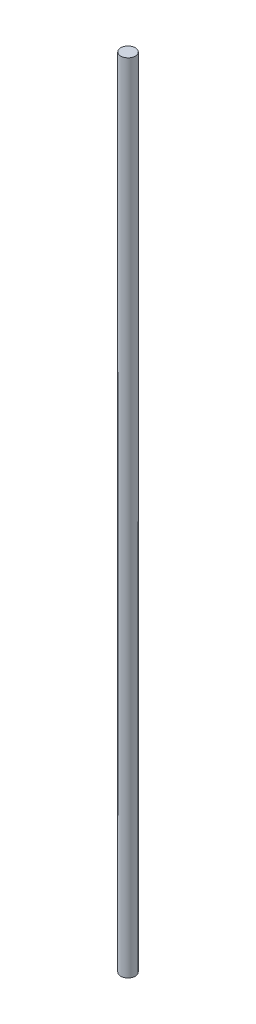
ISO-10303-21;
HEADER;
FILE_DESCRIPTION(('STEP AP214'),'2;1');
FILE_NAME('part.step','',(''),(''),'','','');
FILE_SCHEMA(('AUTOMOTIVE_DESIGN { 1 0 10303 214 1 1 1 1 }'));
ENDSEC;
DATA;
#1=APPLICATION_CONTEXT('core data for automotive mechanical design processes');
#2=APPLICATION_PROTOCOL_DEFINITION('international standard','automotive_design',2000,#1);
#3=PRODUCT_CONTEXT('',#1,'mechanical');
#4=PRODUCT('Part','Part','',(#3));
#5=PRODUCT_RELATED_PRODUCT_CATEGORY('part','',(#4));
#6=PRODUCT_DEFINITION_FORMATION('','',#4);
#7=PRODUCT_DEFINITION_CONTEXT('part definition',#1,'design');
#8=PRODUCT_DEFINITION('design','',#6,#7);
#9=PRODUCT_DEFINITION_SHAPE('','',#8);
#10=(LENGTH_UNIT() NAMED_UNIT(*) SI_UNIT(.MILLI.,.METRE.));
#11=(NAMED_UNIT(*) PLANE_ANGLE_UNIT() SI_UNIT($,.RADIAN.));
#12=(NAMED_UNIT(*) SI_UNIT($,.STERADIAN.) SOLID_ANGLE_UNIT());
#13=UNCERTAINTY_MEASURE_WITH_UNIT(LENGTH_MEASURE(1.E-05),#10,'distance_accuracy_value','');
#14=(GEOMETRIC_REPRESENTATION_CONTEXT(3) GLOBAL_UNCERTAINTY_ASSIGNED_CONTEXT((#13)) GLOBAL_UNIT_ASSIGNED_CONTEXT((#10,
#11,#12)) REPRESENTATION_CONTEXT('',''));
#15=CARTESIAN_POINT('',(0.,0.,0.));
#16=DIRECTION('',(0.,0.,1.));
#17=DIRECTION('',(1.,0.,0.));
#18=AXIS2_PLACEMENT_3D('',#15,#16,#17);
#19=CARTESIAN_POINT('',(0.,439.1,0.));
#20=DIRECTION('',(0.,-1.,0.));
#21=DIRECTION('',(0.,0.,-1.));
#22=AXIS2_PLACEMENT_3D('',#19,#20,#21);
#23=CYLINDRICAL_SURFACE('',#22,4.);
#24=CARTESIAN_POINT('',(0.,439.1,0.));
#25=DIRECTION('',(0.,1.,0.));
#26=DIRECTION('',(0.,0.,1.));
#27=AXIS2_PLACEMENT_3D('',#24,#25,#26);
#28=CIRCLE('',#27,4.);
#29=CARTESIAN_POINT('',(0.,439.1,-4.));
#30=VERTEX_POINT('',#29);
#31=EDGE_CURVE('E10',#30,#30,#28,.T.);
#32=CARTESIAN_POINT('',(0.,0.,0.));
#33=DIRECTION('',(0.,1.,0.));
#34=DIRECTION('',(0.,0.,1.));
#35=AXIS2_PLACEMENT_3D('',#32,#33,#34);
#36=CIRCLE('',#35,4.);
#37=CARTESIAN_POINT('',(0.,0.,-4.));
#38=VERTEX_POINT('',#37);
#39=EDGE_CURVE('E34',#38,#38,#36,.T.);
#40=CARTESIAN_POINT('',(0.,439.1,-4.));
#41=CARTESIAN_POINT('',(0.,434.526041666667,-4.));
#42=CARTESIAN_POINT('',(0.,429.952083333333,-4.));
#43=CARTESIAN_POINT('',(0.,420.804166666667,-4.));
#44=CARTESIAN_POINT('',(0.,416.230208333333,-4.));
#45=CARTESIAN_POINT('',(0.,407.082291666667,-4.));
#46=CARTESIAN_POINT('',(0.,402.508333333333,-4.));
#47=CARTESIAN_POINT('',(0.,393.360416666667,-4.));
#48=CARTESIAN_POINT('',(0.,388.786458333333,-4.));
#49=CARTESIAN_POINT('',(0.,379.638541666667,-4.));
#50=CARTESIAN_POINT('',(0.,375.064583333333,-4.));
#51=CARTESIAN_POINT('',(0.,365.916666666667,-4.));
#52=CARTESIAN_POINT('',(0.,361.342708333333,-4.));
#53=CARTESIAN_POINT('',(0.,352.194791666667,-4.));
#54=CARTESIAN_POINT('',(0.,347.620833333333,-4.));
#55=CARTESIAN_POINT('',(0.,338.472916666667,-4.));
#56=CARTESIAN_POINT('',(0.,333.898958333333,-4.));
#57=CARTESIAN_POINT('',(0.,324.751041666667,-4.));
#58=CARTESIAN_POINT('',(0.,320.177083333333,-4.));
#59=CARTESIAN_POINT('',(0.,311.029166666667,-4.));
#60=CARTESIAN_POINT('',(0.,306.455208333333,-4.));
#61=CARTESIAN_POINT('',(0.,297.307291666667,-4.));
#62=CARTESIAN_POINT('',(0.,292.733333333333,-4.));
#63=CARTESIAN_POINT('',(0.,283.585416666667,-4.));
#64=CARTESIAN_POINT('',(0.,279.011458333333,-4.));
#65=CARTESIAN_POINT('',(0.,269.863541666667,-4.));
#66=CARTESIAN_POINT('',(0.,265.289583333333,-4.));
#67=CARTESIAN_POINT('',(0.,256.141666666667,-4.));
#68=CARTESIAN_POINT('',(0.,251.567708333333,-4.));
#69=CARTESIAN_POINT('',(0.,242.419791666667,-4.));
#70=CARTESIAN_POINT('',(0.,237.845833333333,-4.));
#71=CARTESIAN_POINT('',(0.,228.697916666667,-4.));
#72=CARTESIAN_POINT('',(0.,224.123958333333,-4.));
#73=CARTESIAN_POINT('',(0.,214.976041666667,-4.));
#74=CARTESIAN_POINT('',(0.,210.402083333333,-4.));
#75=CARTESIAN_POINT('',(0.,201.254166666667,-4.));
#76=CARTESIAN_POINT('',(0.,196.680208333333,-4.));
#77=CARTESIAN_POINT('',(0.,187.532291666667,-4.));
#78=CARTESIAN_POINT('',(0.,182.958333333333,-4.));
#79=CARTESIAN_POINT('',(0.,173.810416666667,-4.));
#80=CARTESIAN_POINT('',(0.,169.236458333333,-4.));
#81=CARTESIAN_POINT('',(0.,160.088541666667,-4.));
#82=CARTESIAN_POINT('',(0.,155.514583333333,-4.));
#83=CARTESIAN_POINT('',(0.,146.366666666667,-4.));
#84=CARTESIAN_POINT('',(0.,141.792708333333,-4.));
#85=CARTESIAN_POINT('',(0.,132.644791666667,-4.));
#86=CARTESIAN_POINT('',(0.,128.070833333333,-4.));
#87=CARTESIAN_POINT('',(0.,118.922916666667,-4.));
#88=CARTESIAN_POINT('',(0.,114.348958333333,-4.));
#89=CARTESIAN_POINT('',(0.,105.201041666667,-4.));
#90=CARTESIAN_POINT('',(0.,100.627083333333,-4.));
#91=CARTESIAN_POINT('',(0.,91.4791666666666,-4.));
#92=CARTESIAN_POINT('',(0.,86.9052083333333,-4.));
#93=CARTESIAN_POINT('',(0.,77.7572916666666,-4.));
#94=CARTESIAN_POINT('',(0.,73.1833333333333,-4.));
#95=CARTESIAN_POINT('',(0.,64.0354166666666,-4.));
#96=CARTESIAN_POINT('',(0.,59.4614583333333,-4.));
#97=CARTESIAN_POINT('',(0.,50.3135416666667,-4.));
#98=CARTESIAN_POINT('',(0.,45.7395833333333,-4.));
#99=CARTESIAN_POINT('',(0.,36.5916666666666,-4.));
#100=CARTESIAN_POINT('',(0.,32.0177083333333,-4.));
#101=CARTESIAN_POINT('',(0.,22.8697916666666,-4.));
#102=CARTESIAN_POINT('',(0.,18.2958333333333,-4.));
#103=CARTESIAN_POINT('',(0.,9.14791666666661,-4.));
#104=CARTESIAN_POINT('',(0.,4.57395833333328,-4.));
#105=CARTESIAN_POINT('',(0.,0.,-4.));
#106=B_SPLINE_CURVE_WITH_KNOTS('',3,(#40,#41,#42,#43,#44,#45,#46,#47,#48,#49,#50,#51,#52,#53,
#54,#55,#56,#57,#58,#59,#60,#61,#62,#63,#64,#65,#66,#67,#68,#69,#70,#71,#72,#73,#74,#75,#76,#77,
#78,#79,#80,#81,#82,#83,#84,#85,#86,#87,#88,#89,#90,#91,#92,#93,#94,#95,#96,#97,#98,#99,#100,
#101,#102,#103,#104,#105),.UNSPECIFIED.,.F.,.F.,(4,2,2,2,2,2,2,2,2,2,2,2,2,2,2,2,2,2,2,2,2,2,2,
2,2,2,2,2,2,2,2,2,4),(0.,13.7218750000001,27.44375,41.165625,54.8875,68.609375,82.33125,
96.0531250000001,109.775,123.496875,137.21875,150.940625,164.6625,178.384375,192.10625,
205.828125,219.55,233.271875,246.99375,260.715625,274.4375,288.159375,301.88125,315.603125,
329.325,343.046875,356.76875,370.490625,384.2125,397.934375,411.65625,425.378125,439.1),.UNSPECIFIED.);
#107=EDGE_CURVE('BSEAM31',#30,#38,#106,.T.);
#108=ORIENTED_EDGE('',*,*,#31,.F.);
#109=ORIENTED_EDGE('',*,*,#39,.T.);
#110=ORIENTED_EDGE('',*,*,#107,.T.);
#111=ORIENTED_EDGE('',*,*,#107,.F.);
#112=EDGE_LOOP('',(#108,#110,#109,#111));
#113=FACE_BOUND('',#112,.T.);
#114=ADVANCED_FACE('F31',(#113),#23,.T.);
#115=CARTESIAN_POINT('',(0.,439.1,0.));
#116=DIRECTION('',(0.,1.,0.));
#117=DIRECTION('',(0.,0.,1.));
#118=AXIS2_PLACEMENT_3D('',#115,#116,#117);
#119=PLANE('',#118);
#120=ORIENTED_EDGE('',*,*,#31,.T.);
#121=EDGE_LOOP('',(#120));
#122=FACE_BOUND('',#121,.T.);
#123=ADVANCED_FACE('F46',(#122),#119,.T.);
#124=CARTESIAN_POINT('',(0.,0.,0.));
#125=DIRECTION('',(0.,1.,0.));
#126=DIRECTION('',(0.,0.,1.));
#127=AXIS2_PLACEMENT_3D('',#124,#125,#126);
#128=PLANE('',#127);
#129=ORIENTED_EDGE('',*,*,#39,.F.);
#130=EDGE_LOOP('',(#129));
#131=FACE_BOUND('',#130,.T.);
#132=ADVANCED_FACE('F44',(#131),#128,.F.);
#133=CLOSED_SHELL('',(#114,#123,#132));
#134=MANIFOLD_SOLID_BREP('B2',#133);
#135=ADVANCED_BREP_SHAPE_REPRESENTATION('',(#18,#134),#14);
#136=SHAPE_DEFINITION_REPRESENTATION(#9,#135);
ENDSEC;
END-ISO-10303-21;
